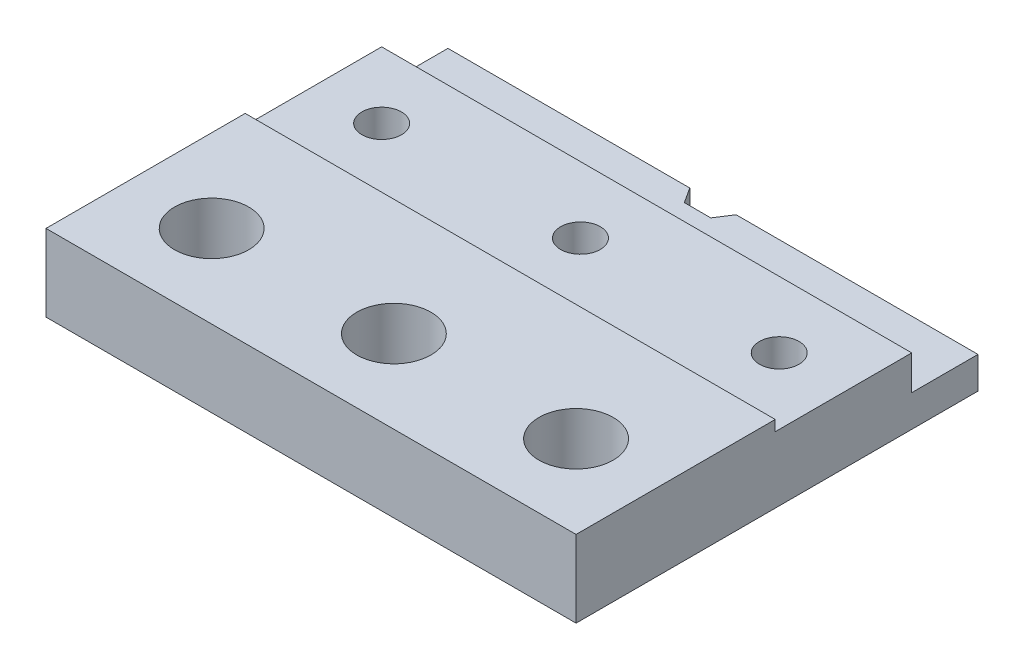
ISO-10303-21;
HEADER;
FILE_DESCRIPTION(('STEP AP214'),'2;1');
FILE_NAME('part.step','',(''),(''),'','','');
FILE_SCHEMA(('AUTOMOTIVE_DESIGN { 1 0 10303 214 1 1 1 1 }'));
ENDSEC;
DATA;
#1=APPLICATION_CONTEXT('core data for automotive mechanical design processes');
#2=APPLICATION_PROTOCOL_DEFINITION('international standard','automotive_design',2000,#1);
#3=PRODUCT_CONTEXT('',#1,'mechanical');
#4=PRODUCT('Part','Part','',(#3));
#5=PRODUCT_RELATED_PRODUCT_CATEGORY('part','',(#4));
#6=PRODUCT_DEFINITION_FORMATION('','',#4);
#7=PRODUCT_DEFINITION_CONTEXT('part definition',#1,'design');
#8=PRODUCT_DEFINITION('design','',#6,#7);
#9=PRODUCT_DEFINITION_SHAPE('','',#8);
#10=(LENGTH_UNIT() NAMED_UNIT(*) SI_UNIT(.MILLI.,.METRE.));
#11=(NAMED_UNIT(*) PLANE_ANGLE_UNIT() SI_UNIT($,.RADIAN.));
#12=(NAMED_UNIT(*) SI_UNIT($,.STERADIAN.) SOLID_ANGLE_UNIT());
#13=UNCERTAINTY_MEASURE_WITH_UNIT(LENGTH_MEASURE(1.E-05),#10,'distance_accuracy_value','');
#14=(GEOMETRIC_REPRESENTATION_CONTEXT(3) GLOBAL_UNCERTAINTY_ASSIGNED_CONTEXT((#13)) GLOBAL_UNIT_ASSIGNED_CONTEXT((#10,
#11,#12)) REPRESENTATION_CONTEXT('',''));
#15=CARTESIAN_POINT('',(0.,0.,0.));
#16=DIRECTION('',(0.,0.,1.));
#17=DIRECTION('',(1.,0.,0.));
#18=AXIS2_PLACEMENT_3D('',#15,#16,#17);
#19=CARTESIAN_POINT('',(25.4,7.366,-19.25955));
#20=DIRECTION('',(0.,0.,1.));
#21=DIRECTION('',(1.,0.,0.));
#22=AXIS2_PLACEMENT_3D('',#19,#20,#21);
#23=PLANE('',#22);
#24=DIRECTION('',(-1.,0.,0.));
#25=VECTOR('',#24,1.);
#26=CARTESIAN_POINT('',(25.4,0.,-19.25955));
#27=LINE('',#26,#25);
#28=CARTESIAN_POINT('',(25.4,0.,-19.25955));
#29=VERTEX_POINT('',#28);
#30=CARTESIAN_POINT('',(2.2225,0.,-19.25955));
#31=VERTEX_POINT('',#30);
#32=EDGE_CURVE('E158',#29,#31,#27,.T.);
#33=ORIENTED_EDGE('',*,*,#32,.T.);
#34=DIRECTION('',(0.,1.,0.));
#35=VECTOR('',#34,1.);
#36=CARTESIAN_POINT('',(2.2225,0.,-19.25955));
#37=LINE('',#36,#35);
#38=CARTESIAN_POINT('',(2.2225,3.048,-19.25955));
#39=VERTEX_POINT('',#38);
#40=EDGE_CURVE('E264',#31,#39,#37,.T.);
#41=ORIENTED_EDGE('',*,*,#40,.T.);
#42=DIRECTION('',(1.,0.,0.));
#43=VECTOR('',#42,1.);
#44=CARTESIAN_POINT('',(-25.4,3.048,-19.25955));
#45=LINE('',#44,#43);
#46=CARTESIAN_POINT('',(25.4,3.048,-19.25955));
#47=VERTEX_POINT('',#46);
#48=EDGE_CURVE('E227',#39,#47,#45,.T.);
#49=ORIENTED_EDGE('',*,*,#48,.T.);
#50=DIRECTION('',(0.,-1.,0.));
#51=VECTOR('',#50,1.);
#52=CARTESIAN_POINT('',(25.4,7.366,-19.25955));
#53=LINE('',#52,#51);
#54=EDGE_CURVE('E11',#47,#29,#53,.T.);
#55=ORIENTED_EDGE('',*,*,#54,.T.);
#56=EDGE_LOOP('',(#33,#41,#49,#55));
#57=FACE_BOUND('',#56,.T.);
#58=ADVANCED_FACE('F42',(#57),#23,.F.);
#59=CARTESIAN_POINT('',(25.4,7.366,-19.25955));
#60=DIRECTION('',(-1.,0.,0.));
#61=DIRECTION('',(0.,0.,1.));
#62=AXIS2_PLACEMENT_3D('',#59,#60,#61);
#63=PLANE('',#62);
#64=ORIENTED_EDGE('',*,*,#54,.F.);
#65=DIRECTION('',(0.,0.,-1.));
#66=VECTOR('',#65,1.);
#67=CARTESIAN_POINT('',(25.4,3.048,-19.25955));
#68=LINE('',#67,#66);
#69=CARTESIAN_POINT('',(25.4,3.048,-12.90955));
#70=VERTEX_POINT('',#69);
#71=EDGE_CURVE('E221',#70,#47,#68,.T.);
#72=ORIENTED_EDGE('',*,*,#71,.F.);
#73=DIRECTION('',(0.,-1.,0.));
#74=VECTOR('',#73,1.);
#75=CARTESIAN_POINT('',(25.4,3.048,-12.90955));
#76=LINE('',#75,#74);
#77=CARTESIAN_POINT('',(25.4,6.35,-12.90955));
#78=VERTEX_POINT('',#77);
#79=EDGE_CURVE('E217',#78,#70,#76,.T.);
#80=ORIENTED_EDGE('',*,*,#79,.F.);
#81=DIRECTION('',(0.,0.,-1.));
#82=VECTOR('',#81,1.);
#83=CARTESIAN_POINT('',(25.4,6.35,-12.90955));
#84=LINE('',#83,#82);
#85=CARTESIAN_POINT('',(25.4,6.35,0.171450000000004));
#86=VERTEX_POINT('',#85);
#87=EDGE_CURVE('E212',#86,#78,#84,.T.);
#88=ORIENTED_EDGE('',*,*,#87,.F.);
#89=DIRECTION('',(0.,-1.,0.));
#90=VECTOR('',#89,1.);
#91=CARTESIAN_POINT('',(25.4,6.35,0.171450000000004));
#92=LINE('',#91,#90);
#93=CARTESIAN_POINT('',(25.4,7.366,0.171450000000004));
#94=VERTEX_POINT('',#93);
#95=EDGE_CURVE('E208',#94,#86,#92,.T.);
#96=ORIENTED_EDGE('',*,*,#95,.F.);
#97=DIRECTION('',(0.,0.,-1.));
#98=VECTOR('',#97,1.);
#99=CARTESIAN_POINT('',(25.4,7.366,-19.25955));
#100=LINE('',#99,#98);
#101=CARTESIAN_POINT('',(25.4,7.366,19.25955));
#102=VERTEX_POINT('',#101);
#103=EDGE_CURVE('E174',#102,#94,#100,.T.);
#104=ORIENTED_EDGE('',*,*,#103,.F.);
#105=DIRECTION('',(0.,-1.,0.));
#106=VECTOR('',#105,1.);
#107=CARTESIAN_POINT('',(25.4,7.366,19.25955));
#108=LINE('',#107,#106);
#109=CARTESIAN_POINT('',(25.4,0.,19.25955));
#110=VERTEX_POINT('',#109);
#111=EDGE_CURVE('E175',#102,#110,#108,.T.);
#112=ORIENTED_EDGE('',*,*,#111,.T.);
#113=DIRECTION('',(0.,0.,-1.));
#114=VECTOR('',#113,1.);
#115=CARTESIAN_POINT('',(25.4,0.,-19.25955));
#116=LINE('',#115,#114);
#117=EDGE_CURVE('E159',#110,#29,#116,.T.);
#118=ORIENTED_EDGE('',*,*,#117,.T.);
#119=EDGE_LOOP('',(#64,#72,#80,#88,#96,#104,#112,#118));
#120=FACE_BOUND('',#119,.T.);
#121=ADVANCED_FACE('F44',(#120),#63,.F.);
#122=CARTESIAN_POINT('',(-25.4,3.048,-19.25955));
#123=VERTEX_POINT('',#122);
#124=CARTESIAN_POINT('',(-2.2225,3.048,-19.25955));
#125=VERTEX_POINT('',#124);
#126=EDGE_CURVE('E147',#123,#125,#45,.T.);
#127=ORIENTED_EDGE('',*,*,#126,.T.);
#128=DIRECTION('',(0.,1.,0.));
#129=VECTOR('',#128,1.);
#130=CARTESIAN_POINT('',(-2.2225,0.,-19.25955));
#131=LINE('',#130,#129);
#132=CARTESIAN_POINT('',(-2.2225,0.,-19.25955));
#133=VERTEX_POINT('',#132);
#134=EDGE_CURVE('E58',#133,#125,#131,.T.);
#135=ORIENTED_EDGE('',*,*,#134,.F.);
#136=CARTESIAN_POINT('',(-25.4,0.,-19.25955));
#137=VERTEX_POINT('',#136);
#138=EDGE_CURVE('E145',#133,#137,#27,.T.);
#139=ORIENTED_EDGE('',*,*,#138,.T.);
#140=DIRECTION('',(0.,-1.,0.));
#141=VECTOR('',#140,1.);
#142=CARTESIAN_POINT('',(-25.4,7.366,-19.25955));
#143=LINE('',#142,#141);
#144=EDGE_CURVE('E51',#123,#137,#143,.T.);
#145=ORIENTED_EDGE('',*,*,#144,.F.);
#146=EDGE_LOOP('',(#127,#135,#139,#145));
#147=FACE_BOUND('',#146,.T.);
#148=ADVANCED_FACE('F143',(#147),#23,.F.);
#149=CARTESIAN_POINT('',(-25.4,7.366,-19.25955));
#150=DIRECTION('',(1.,0.,0.));
#151=DIRECTION('',(0.,0.,-1.));
#152=AXIS2_PLACEMENT_3D('',#149,#150,#151);
#153=PLANE('',#152);
#154=DIRECTION('',(0.,-1.,0.));
#155=VECTOR('',#154,1.);
#156=CARTESIAN_POINT('',(-25.4,3.048,-12.90955));
#157=LINE('',#156,#155);
#158=CARTESIAN_POINT('',(-25.4,6.35,-12.90955));
#159=VERTEX_POINT('',#158);
#160=CARTESIAN_POINT('',(-25.4,3.048,-12.90955));
#161=VERTEX_POINT('',#160);
#162=EDGE_CURVE('E194',#159,#161,#157,.T.);
#163=ORIENTED_EDGE('',*,*,#162,.T.);
#164=DIRECTION('',(0.,0.,-1.));
#165=VECTOR('',#164,1.);
#166=CARTESIAN_POINT('',(-25.4,3.048,-19.25955));
#167=LINE('',#166,#165);
#168=EDGE_CURVE('E191',#161,#123,#167,.T.);
#169=ORIENTED_EDGE('',*,*,#168,.T.);
#170=ORIENTED_EDGE('',*,*,#144,.T.);
#171=DIRECTION('',(0.,0.,1.));
#172=VECTOR('',#171,1.);
#173=CARTESIAN_POINT('',(-25.4,0.,-19.25955));
#174=LINE('',#173,#172);
#175=CARTESIAN_POINT('',(-25.4,0.,19.25955));
#176=VERTEX_POINT('',#175);
#177=EDGE_CURVE('E156',#137,#176,#174,.T.);
#178=ORIENTED_EDGE('',*,*,#177,.T.);
#179=DIRECTION('',(0.,-1.,0.));
#180=VECTOR('',#179,1.);
#181=CARTESIAN_POINT('',(-25.4,7.366,19.25955));
#182=LINE('',#181,#180);
#183=CARTESIAN_POINT('',(-25.4,7.366,19.25955));
#184=VERTEX_POINT('',#183);
#185=EDGE_CURVE('E179',#184,#176,#182,.T.);
#186=ORIENTED_EDGE('',*,*,#185,.F.);
#187=DIRECTION('',(0.,0.,1.));
#188=VECTOR('',#187,1.);
#189=CARTESIAN_POINT('',(-25.4,7.366,-19.25955));
#190=LINE('',#189,#188);
#191=CARTESIAN_POINT('',(-25.4,7.366,0.171449999999997));
#192=VERTEX_POINT('',#191);
#193=EDGE_CURVE('E239',#192,#184,#190,.T.);
#194=ORIENTED_EDGE('',*,*,#193,.F.);
#195=DIRECTION('',(0.,-1.,0.));
#196=VECTOR('',#195,1.);
#197=CARTESIAN_POINT('',(-25.4,6.35,0.171450000000004));
#198=LINE('',#197,#196);
#199=CARTESIAN_POINT('',(-25.4,6.35,0.171450000000004));
#200=VERTEX_POINT('',#199);
#201=EDGE_CURVE('E66',#192,#200,#198,.T.);
#202=ORIENTED_EDGE('',*,*,#201,.T.);
#203=DIRECTION('',(0.,0.,-1.));
#204=VECTOR('',#203,1.);
#205=CARTESIAN_POINT('',(-25.4,6.35,-12.90955));
#206=LINE('',#205,#204);
#207=EDGE_CURVE('E204',#200,#159,#206,.T.);
#208=ORIENTED_EDGE('',*,*,#207,.T.);
#209=EDGE_LOOP('',(#163,#169,#170,#178,#186,#194,#202,#208));
#210=FACE_BOUND('',#209,.T.);
#211=ADVANCED_FACE('F188',(#210),#153,.F.);
#212=CARTESIAN_POINT('',(25.4,7.366,19.25955));
#213=DIRECTION('',(0.,0.,-1.));
#214=DIRECTION('',(-1.,0.,0.));
#215=AXIS2_PLACEMENT_3D('',#212,#213,#214);
#216=PLANE('',#215);
#217=DIRECTION('',(1.,0.,0.));
#218=VECTOR('',#217,1.);
#219=CARTESIAN_POINT('',(25.4,0.,19.25955));
#220=LINE('',#219,#218);
#221=EDGE_CURVE('E171',#176,#110,#220,.T.);
#222=ORIENTED_EDGE('',*,*,#221,.T.);
#223=ORIENTED_EDGE('',*,*,#111,.F.);
#224=DIRECTION('',(1.,0.,0.));
#225=VECTOR('',#224,1.);
#226=CARTESIAN_POINT('',(25.4,7.366,19.25955));
#227=LINE('',#226,#225);
#228=EDGE_CURVE('E180',#184,#102,#227,.T.);
#229=ORIENTED_EDGE('',*,*,#228,.F.);
#230=ORIENTED_EDGE('',*,*,#185,.T.);
#231=EDGE_LOOP('',(#222,#223,#229,#230));
#232=FACE_BOUND('',#231,.T.);
#233=ADVANCED_FACE('F250',(#232),#216,.F.);
#234=CARTESIAN_POINT('',(0.,7.366,0.));
#235=DIRECTION('',(0.,-1.,0.));
#236=DIRECTION('',(0.,0.,-1.));
#237=AXIS2_PLACEMENT_3D('',#234,#235,#236);
#238=PLANE('',#237);
#239=CARTESIAN_POINT('',(17.4625,7.366,11.32205));
#240=DIRECTION('',(0.,1.,0.));
#241=DIRECTION('',(0.,0.,1.));
#242=AXIS2_PLACEMENT_3D('',#239,#240,#241);
#243=CIRCLE('',#242,3.556);
#244=CARTESIAN_POINT('',(17.4625,7.366,14.87805));
#245=VERTEX_POINT('',#244);
#246=EDGE_CURVE('E296',#245,#245,#243,.T.);
#247=ORIENTED_EDGE('',*,*,#246,.F.);
#248=EDGE_LOOP('',(#247));
#249=FACE_BOUND('',#248,.T.);
#250=CARTESIAN_POINT('',(0.,7.366,11.32205));
#251=DIRECTION('',(0.,1.,0.));
#252=DIRECTION('',(0.,0.,1.));
#253=AXIS2_PLACEMENT_3D('',#250,#251,#252);
#254=CIRCLE('',#253,3.556);
#255=CARTESIAN_POINT('',(0.,7.366,14.87805));
#256=VERTEX_POINT('',#255);
#257=EDGE_CURVE('E288',#256,#256,#254,.T.);
#258=ORIENTED_EDGE('',*,*,#257,.F.);
#259=EDGE_LOOP('',(#258));
#260=FACE_BOUND('',#259,.T.);
#261=CARTESIAN_POINT('',(-17.4625,7.366,11.32205));
#262=DIRECTION('',(0.,1.,0.));
#263=DIRECTION('',(0.,0.,1.));
#264=AXIS2_PLACEMENT_3D('',#261,#262,#263);
#265=CIRCLE('',#264,3.556);
#266=CARTESIAN_POINT('',(-17.4625,7.366,14.87805));
#267=VERTEX_POINT('',#266);
#268=EDGE_CURVE('E280',#267,#267,#265,.T.);
#269=ORIENTED_EDGE('',*,*,#268,.F.);
#270=EDGE_LOOP('',(#269));
#271=FACE_BOUND('',#270,.T.);
#272=ORIENTED_EDGE('',*,*,#103,.T.);
#273=DIRECTION('',(1.,0.,0.));
#274=VECTOR('',#273,1.);
#275=CARTESIAN_POINT('',(-25.4,7.366,0.171450000000004));
#276=LINE('',#275,#274);
#277=EDGE_CURVE('E197',#192,#94,#276,.T.);
#278=ORIENTED_EDGE('',*,*,#277,.F.);
#279=ORIENTED_EDGE('',*,*,#193,.T.);
#280=ORIENTED_EDGE('',*,*,#228,.T.);
#281=EDGE_LOOP('',(#272,#278,#279,#280));
#282=FACE_BOUND('',#281,.T.);
#283=ADVANCED_FACE('F246',(#249,#260,#271,#282),#238,.F.);
#284=CARTESIAN_POINT('',(0.,0.,0.));
#285=DIRECTION('',(0.,-1.,0.));
#286=DIRECTION('',(0.,0.,-1.));
#287=AXIS2_PLACEMENT_3D('',#284,#285,#286);
#288=PLANE('',#287);
#289=CARTESIAN_POINT('',(19.05,0.,-6.55955));
#290=DIRECTION('',(0.,1.,0.));
#291=DIRECTION('',(0.,0.,1.));
#292=AXIS2_PLACEMENT_3D('',#289,#290,#291);
#293=CIRCLE('',#292,1.89865);
#294=CARTESIAN_POINT('',(19.05,0.,-4.6609));
#295=VERTEX_POINT('',#294);
#296=EDGE_CURVE('E336',#295,#295,#293,.T.);
#297=ORIENTED_EDGE('',*,*,#296,.T.);
#298=EDGE_LOOP('',(#297));
#299=FACE_BOUND('',#298,.T.);
#300=CARTESIAN_POINT('',(0.,0.,-6.55955));
#301=DIRECTION('',(0.,1.,0.));
#302=DIRECTION('',(0.,0.,1.));
#303=AXIS2_PLACEMENT_3D('',#300,#301,#302);
#304=CIRCLE('',#303,1.89865);
#305=CARTESIAN_POINT('',(0.,0.,-4.6609));
#306=VERTEX_POINT('',#305);
#307=EDGE_CURVE('E328',#306,#306,#304,.T.);
#308=ORIENTED_EDGE('',*,*,#307,.T.);
#309=EDGE_LOOP('',(#308));
#310=FACE_BOUND('',#309,.T.);
#311=CARTESIAN_POINT('',(-19.05,0.,-6.55955));
#312=DIRECTION('',(0.,1.,0.));
#313=DIRECTION('',(0.,0.,1.));
#314=AXIS2_PLACEMENT_3D('',#311,#312,#313);
#315=CIRCLE('',#314,1.89865);
#316=CARTESIAN_POINT('',(-19.05,0.,-4.6609));
#317=VERTEX_POINT('',#316);
#318=EDGE_CURVE('E316',#317,#317,#315,.T.);
#319=ORIENTED_EDGE('',*,*,#318,.T.);
#320=EDGE_LOOP('',(#319));
#321=FACE_BOUND('',#320,.T.);
#322=DIRECTION('',(0.542951075362605,0.,-0.839764329894162));
#323=VECTOR('',#322,1.);
#324=CARTESIAN_POINT('',(1.27,0.,-17.78635));
#325=LINE('',#324,#323);
#326=CARTESIAN_POINT('',(1.27,0.,-17.78635));
#327=VERTEX_POINT('',#326);
#328=EDGE_CURVE('E149',#327,#31,#325,.T.);
#329=ORIENTED_EDGE('',*,*,#328,.T.);
#330=ORIENTED_EDGE('',*,*,#32,.F.);
#331=ORIENTED_EDGE('',*,*,#117,.F.);
#332=ORIENTED_EDGE('',*,*,#221,.F.);
#333=ORIENTED_EDGE('',*,*,#177,.F.);
#334=ORIENTED_EDGE('',*,*,#138,.F.);
#335=DIRECTION('',(0.542951075362605,0.,0.839764329894162));
#336=VECTOR('',#335,1.);
#337=CARTESIAN_POINT('',(-2.2225,0.,-19.25955));
#338=LINE('',#337,#336);
#339=CARTESIAN_POINT('',(-1.27,0.,-17.78635));
#340=VERTEX_POINT('',#339);
#341=EDGE_CURVE('E130',#133,#340,#338,.T.);
#342=ORIENTED_EDGE('',*,*,#341,.T.);
#343=DIRECTION('',(1.,0.,0.));
#344=VECTOR('',#343,1.);
#345=CARTESIAN_POINT('',(-1.27,0.,-17.78635));
#346=LINE('',#345,#344);
#347=EDGE_CURVE('E138',#340,#327,#346,.T.);
#348=ORIENTED_EDGE('',*,*,#347,.T.);
#349=EDGE_LOOP('',(#329,#330,#331,#332,#333,#334,#342,#348));
#350=FACE_BOUND('',#349,.T.);
#351=CARTESIAN_POINT('',(17.4625,0.,11.32205));
#352=DIRECTION('',(0.,1.,0.));
#353=DIRECTION('',(0.,0.,1.));
#354=AXIS2_PLACEMENT_3D('',#351,#352,#353);
#355=CIRCLE('',#354,3.556);
#356=CARTESIAN_POINT('',(17.4625,0.,14.87805));
#357=VERTEX_POINT('',#356);
#358=EDGE_CURVE('E292',#357,#357,#355,.T.);
#359=ORIENTED_EDGE('',*,*,#358,.T.);
#360=EDGE_LOOP('',(#359));
#361=FACE_BOUND('',#360,.T.);
#362=CARTESIAN_POINT('',(0.,0.,11.32205));
#363=DIRECTION('',(0.,1.,0.));
#364=DIRECTION('',(0.,0.,1.));
#365=AXIS2_PLACEMENT_3D('',#362,#363,#364);
#366=CIRCLE('',#365,3.556);
#367=CARTESIAN_POINT('',(0.,0.,14.87805));
#368=VERTEX_POINT('',#367);
#369=EDGE_CURVE('E284',#368,#368,#366,.T.);
#370=ORIENTED_EDGE('',*,*,#369,.T.);
#371=EDGE_LOOP('',(#370));
#372=FACE_BOUND('',#371,.T.);
#373=CARTESIAN_POINT('',(-17.4625,0.,11.32205));
#374=DIRECTION('',(0.,1.,0.));
#375=DIRECTION('',(0.,0.,1.));
#376=AXIS2_PLACEMENT_3D('',#373,#374,#375);
#377=CIRCLE('',#376,3.556);
#378=CARTESIAN_POINT('',(-17.4625,0.,14.87805));
#379=VERTEX_POINT('',#378);
#380=EDGE_CURVE('E213',#379,#379,#377,.T.);
#381=ORIENTED_EDGE('',*,*,#380,.T.);
#382=EDGE_LOOP('',(#381));
#383=FACE_BOUND('',#382,.T.);
#384=ADVANCED_FACE('F153',(#299,#310,#321,#350,#361,#372,#383),#288,.T.);
#385=CARTESIAN_POINT('',(-25.4,3.048,-19.25955));
#386=DIRECTION('',(0.,-1.,0.));
#387=DIRECTION('',(0.,0.,-1.));
#388=AXIS2_PLACEMENT_3D('',#385,#386,#387);
#389=PLANE('',#388);
#390=ORIENTED_EDGE('',*,*,#48,.F.);
#391=DIRECTION('',(0.542951075362605,0.,-0.839764329894162));
#392=VECTOR('',#391,1.);
#393=CARTESIAN_POINT('',(1.27,3.048,-17.78635));
#394=LINE('',#393,#392);
#395=CARTESIAN_POINT('',(1.27,3.048,-17.78635));
#396=VERTEX_POINT('',#395);
#397=EDGE_CURVE('E139',#396,#39,#394,.T.);
#398=ORIENTED_EDGE('',*,*,#397,.F.);
#399=DIRECTION('',(1.,0.,0.));
#400=VECTOR('',#399,1.);
#401=CARTESIAN_POINT('',(-1.27,3.048,-17.78635));
#402=LINE('',#401,#400);
#403=CARTESIAN_POINT('',(-1.27,3.048,-17.78635));
#404=VERTEX_POINT('',#403);
#405=EDGE_CURVE('E309',#404,#396,#402,.T.);
#406=ORIENTED_EDGE('',*,*,#405,.F.);
#407=DIRECTION('',(0.542951075362605,0.,0.839764329894162));
#408=VECTOR('',#407,1.);
#409=CARTESIAN_POINT('',(-2.2225,3.048,-19.25955));
#410=LINE('',#409,#408);
#411=EDGE_CURVE('E313',#125,#404,#410,.T.);
#412=ORIENTED_EDGE('',*,*,#411,.F.);
#413=ORIENTED_EDGE('',*,*,#126,.F.);
#414=ORIENTED_EDGE('',*,*,#168,.F.);
#415=DIRECTION('',(1.,0.,0.));
#416=VECTOR('',#415,1.);
#417=CARTESIAN_POINT('',(-25.4,3.048,-12.90955));
#418=LINE('',#417,#416);
#419=EDGE_CURVE('E228',#161,#70,#418,.T.);
#420=ORIENTED_EDGE('',*,*,#419,.T.);
#421=ORIENTED_EDGE('',*,*,#71,.T.);
#422=EDGE_LOOP('',(#390,#398,#406,#412,#413,#414,#420,#421));
#423=FACE_BOUND('',#422,.T.);
#424=ADVANCED_FACE('F267',(#423),#389,.F.);
#425=CARTESIAN_POINT('',(-25.4,3.048,-12.90955));
#426=DIRECTION('',(0.,0.,1.));
#427=DIRECTION('',(1.,0.,0.));
#428=AXIS2_PLACEMENT_3D('',#425,#426,#427);
#429=PLANE('',#428);
#430=ORIENTED_EDGE('',*,*,#79,.T.);
#431=ORIENTED_EDGE('',*,*,#419,.F.);
#432=ORIENTED_EDGE('',*,*,#162,.F.);
#433=DIRECTION('',(1.,0.,0.));
#434=VECTOR('',#433,1.);
#435=CARTESIAN_POINT('',(-25.4,6.35,-12.90955));
#436=LINE('',#435,#434);
#437=EDGE_CURVE('E231',#159,#78,#436,.T.);
#438=ORIENTED_EDGE('',*,*,#437,.T.);
#439=EDGE_LOOP('',(#430,#431,#432,#438));
#440=FACE_BOUND('',#439,.T.);
#441=ADVANCED_FACE('F269',(#440),#429,.F.);
#442=CARTESIAN_POINT('',(-25.4,6.35,-12.90955));
#443=DIRECTION('',(0.,-1.,0.));
#444=DIRECTION('',(0.,0.,-1.));
#445=AXIS2_PLACEMENT_3D('',#442,#443,#444);
#446=PLANE('',#445);
#447=CARTESIAN_POINT('',(19.05,6.35,-6.55955));
#448=DIRECTION('',(0.,1.,0.));
#449=DIRECTION('',(0.,0.,1.));
#450=AXIS2_PLACEMENT_3D('',#447,#448,#449);
#451=CIRCLE('',#450,1.89865);
#452=CARTESIAN_POINT('',(19.05,6.35,-4.6609));
#453=VERTEX_POINT('',#452);
#454=EDGE_CURVE('E340',#453,#453,#451,.T.);
#455=ORIENTED_EDGE('',*,*,#454,.F.);
#456=EDGE_LOOP('',(#455));
#457=FACE_BOUND('',#456,.T.);
#458=CARTESIAN_POINT('',(0.,6.35,-6.55955));
#459=DIRECTION('',(0.,1.,0.));
#460=DIRECTION('',(0.,0.,1.));
#461=AXIS2_PLACEMENT_3D('',#458,#459,#460);
#462=CIRCLE('',#461,1.89865);
#463=CARTESIAN_POINT('',(0.,6.35,-4.6609));
#464=VERTEX_POINT('',#463);
#465=EDGE_CURVE('E332',#464,#464,#462,.T.);
#466=ORIENTED_EDGE('',*,*,#465,.F.);
#467=EDGE_LOOP('',(#466));
#468=FACE_BOUND('',#467,.T.);
#469=CARTESIAN_POINT('',(-19.05,6.35,-6.55955));
#470=DIRECTION('',(0.,1.,0.));
#471=DIRECTION('',(0.,0.,1.));
#472=AXIS2_PLACEMENT_3D('',#469,#470,#471);
#473=CIRCLE('',#472,1.89865);
#474=CARTESIAN_POINT('',(-19.05,6.35,-4.6609));
#475=VERTEX_POINT('',#474);
#476=EDGE_CURVE('E324',#475,#475,#473,.T.);
#477=ORIENTED_EDGE('',*,*,#476,.F.);
#478=EDGE_LOOP('',(#477));
#479=FACE_BOUND('',#478,.T.);
#480=ORIENTED_EDGE('',*,*,#87,.T.);
#481=ORIENTED_EDGE('',*,*,#437,.F.);
#482=ORIENTED_EDGE('',*,*,#207,.F.);
#483=DIRECTION('',(1.,0.,0.));
#484=VECTOR('',#483,1.);
#485=CARTESIAN_POINT('',(-25.4,6.35,0.171450000000004));
#486=LINE('',#485,#484);
#487=EDGE_CURVE('E202',#200,#86,#486,.T.);
#488=ORIENTED_EDGE('',*,*,#487,.T.);
#489=EDGE_LOOP('',(#480,#481,#482,#488));
#490=FACE_BOUND('',#489,.T.);
#491=ADVANCED_FACE('F271',(#457,#468,#479,#490),#446,.F.);
#492=CARTESIAN_POINT('',(-25.4,6.35,0.171450000000004));
#493=DIRECTION('',(0.,0.,1.));
#494=DIRECTION('',(1.,0.,0.));
#495=AXIS2_PLACEMENT_3D('',#492,#493,#494);
#496=PLANE('',#495);
#497=ORIENTED_EDGE('',*,*,#95,.T.);
#498=ORIENTED_EDGE('',*,*,#487,.F.);
#499=ORIENTED_EDGE('',*,*,#201,.F.);
#500=ORIENTED_EDGE('',*,*,#277,.T.);
#501=EDGE_LOOP('',(#497,#498,#499,#500));
#502=FACE_BOUND('',#501,.T.);
#503=ADVANCED_FACE('F257',(#502),#496,.F.);
#504=CARTESIAN_POINT('',(-17.4625,7.366,11.32205));
#505=DIRECTION('',(0.,1.,0.));
#506=DIRECTION('',(0.,0.,1.));
#507=AXIS2_PLACEMENT_3D('',#504,#505,#506);
#508=CYLINDRICAL_SURFACE('',#507,3.556);
#509=ORIENTED_EDGE('',*,*,#380,.F.);
#510=EDGE_LOOP('',(#509));
#511=FACE_BOUND('',#510,.T.);
#512=ORIENTED_EDGE('',*,*,#268,.T.);
#513=EDGE_LOOP('',(#512));
#514=FACE_BOUND('',#513,.T.);
#515=ADVANCED_FACE('F391',(#511,#514),#508,.F.);
#516=CARTESIAN_POINT('',(0.,7.366,11.32205));
#517=DIRECTION('',(0.,1.,0.));
#518=DIRECTION('',(0.,0.,1.));
#519=AXIS2_PLACEMENT_3D('',#516,#517,#518);
#520=CYLINDRICAL_SURFACE('',#519,3.556);
#521=ORIENTED_EDGE('',*,*,#369,.F.);
#522=EDGE_LOOP('',(#521));
#523=FACE_BOUND('',#522,.T.);
#524=ORIENTED_EDGE('',*,*,#257,.T.);
#525=EDGE_LOOP('',(#524));
#526=FACE_BOUND('',#525,.T.);
#527=ADVANCED_FACE('F399',(#523,#526),#520,.F.);
#528=CARTESIAN_POINT('',(17.4625,7.366,11.32205));
#529=DIRECTION('',(0.,1.,0.));
#530=DIRECTION('',(0.,0.,1.));
#531=AXIS2_PLACEMENT_3D('',#528,#529,#530);
#532=CYLINDRICAL_SURFACE('',#531,3.556);
#533=ORIENTED_EDGE('',*,*,#358,.F.);
#534=EDGE_LOOP('',(#533));
#535=FACE_BOUND('',#534,.T.);
#536=ORIENTED_EDGE('',*,*,#246,.T.);
#537=EDGE_LOOP('',(#536));
#538=FACE_BOUND('',#537,.T.);
#539=ADVANCED_FACE('F403',(#535,#538),#532,.F.);
#540=CARTESIAN_POINT('',(1.27,0.,-17.78635));
#541=DIRECTION('',(0.839764329894162,0.,0.542951075362605));
#542=DIRECTION('',(0.542951075362605,0.,-0.839764329894162));
#543=AXIS2_PLACEMENT_3D('',#540,#541,#542);
#544=PLANE('',#543);
#545=ORIENTED_EDGE('',*,*,#397,.T.);
#546=ORIENTED_EDGE('',*,*,#40,.F.);
#547=ORIENTED_EDGE('',*,*,#328,.F.);
#548=DIRECTION('',(0.,1.,0.));
#549=VECTOR('',#548,1.);
#550=CARTESIAN_POINT('',(1.27,0.,-17.78635));
#551=LINE('',#550,#549);
#552=EDGE_CURVE('E302',#327,#396,#551,.T.);
#553=ORIENTED_EDGE('',*,*,#552,.T.);
#554=EDGE_LOOP('',(#545,#546,#547,#553));
#555=FACE_BOUND('',#554,.T.);
#556=ADVANCED_FACE('F406',(#555),#544,.F.);
#557=CARTESIAN_POINT('',(-1.27,0.,-17.78635));
#558=DIRECTION('',(0.,0.,1.));
#559=DIRECTION('',(0.,-1.,0.));
#560=AXIS2_PLACEMENT_3D('',#557,#558,#559);
#561=PLANE('',#560);
#562=ORIENTED_EDGE('',*,*,#405,.T.);
#563=ORIENTED_EDGE('',*,*,#552,.F.);
#564=ORIENTED_EDGE('',*,*,#347,.F.);
#565=DIRECTION('',(0.,1.,0.));
#566=VECTOR('',#565,1.);
#567=CARTESIAN_POINT('',(-1.27,0.,-17.78635));
#568=LINE('',#567,#566);
#569=EDGE_CURVE('E132',#340,#404,#568,.T.);
#570=ORIENTED_EDGE('',*,*,#569,.T.);
#571=EDGE_LOOP('',(#562,#563,#564,#570));
#572=FACE_BOUND('',#571,.T.);
#573=ADVANCED_FACE('F366',(#572),#561,.F.);
#574=CARTESIAN_POINT('',(-2.2225,0.,-19.25955));
#575=DIRECTION('',(-0.839764329894162,0.,0.542951075362605));
#576=DIRECTION('',(0.542951075362605,0.,0.839764329894162));
#577=AXIS2_PLACEMENT_3D('',#574,#575,#576);
#578=PLANE('',#577);
#579=ORIENTED_EDGE('',*,*,#411,.T.);
#580=ORIENTED_EDGE('',*,*,#569,.F.);
#581=ORIENTED_EDGE('',*,*,#341,.F.);
#582=ORIENTED_EDGE('',*,*,#134,.T.);
#583=EDGE_LOOP('',(#579,#580,#581,#582));
#584=FACE_BOUND('',#583,.T.);
#585=ADVANCED_FACE('F131',(#584),#578,.F.);
#586=CARTESIAN_POINT('',(-19.05,6.35,-6.55955));
#587=DIRECTION('',(0.,1.,0.));
#588=DIRECTION('',(0.,0.,1.));
#589=AXIS2_PLACEMENT_3D('',#586,#587,#588);
#590=CYLINDRICAL_SURFACE('',#589,1.89865);
#591=ORIENTED_EDGE('',*,*,#318,.F.);
#592=EDGE_LOOP('',(#591));
#593=FACE_BOUND('',#592,.T.);
#594=ORIENTED_EDGE('',*,*,#476,.T.);
#595=EDGE_LOOP('',(#594));
#596=FACE_BOUND('',#595,.T.);
#597=ADVANCED_FACE('F355',(#593,#596),#590,.F.);
#598=CARTESIAN_POINT('',(0.,6.35,-6.55955));
#599=DIRECTION('',(0.,1.,0.));
#600=DIRECTION('',(0.,0.,1.));
#601=AXIS2_PLACEMENT_3D('',#598,#599,#600);
#602=CYLINDRICAL_SURFACE('',#601,1.89865);
#603=ORIENTED_EDGE('',*,*,#307,.F.);
#604=EDGE_LOOP('',(#603));
#605=FACE_BOUND('',#604,.T.);
#606=ORIENTED_EDGE('',*,*,#465,.T.);
#607=EDGE_LOOP('',(#606));
#608=FACE_BOUND('',#607,.T.);
#609=ADVANCED_FACE('F357',(#605,#608),#602,.F.);
#610=CARTESIAN_POINT('',(19.05,6.35,-6.55955));
#611=DIRECTION('',(0.,1.,0.));
#612=DIRECTION('',(0.,0.,1.));
#613=AXIS2_PLACEMENT_3D('',#610,#611,#612);
#614=CYLINDRICAL_SURFACE('',#613,1.89865);
#615=ORIENTED_EDGE('',*,*,#296,.F.);
#616=EDGE_LOOP('',(#615));
#617=FACE_BOUND('',#616,.T.);
#618=ORIENTED_EDGE('',*,*,#454,.T.);
#619=EDGE_LOOP('',(#618));
#620=FACE_BOUND('',#619,.T.);
#621=ADVANCED_FACE('F346',(#617,#620),#614,.F.);
#622=CLOSED_SHELL('',(#58,#121,#148,#211,#233,#283,#384,#424,#441,#491,#503,#515,#527,#539,#556,
#573,#585,#597,#609,#621));
#623=MANIFOLD_SOLID_BREP('B2',#622);
#624=ADVANCED_BREP_SHAPE_REPRESENTATION('',(#18,#623),#14);
#625=SHAPE_DEFINITION_REPRESENTATION(#9,#624);
ENDSEC;
END-ISO-10303-21;
